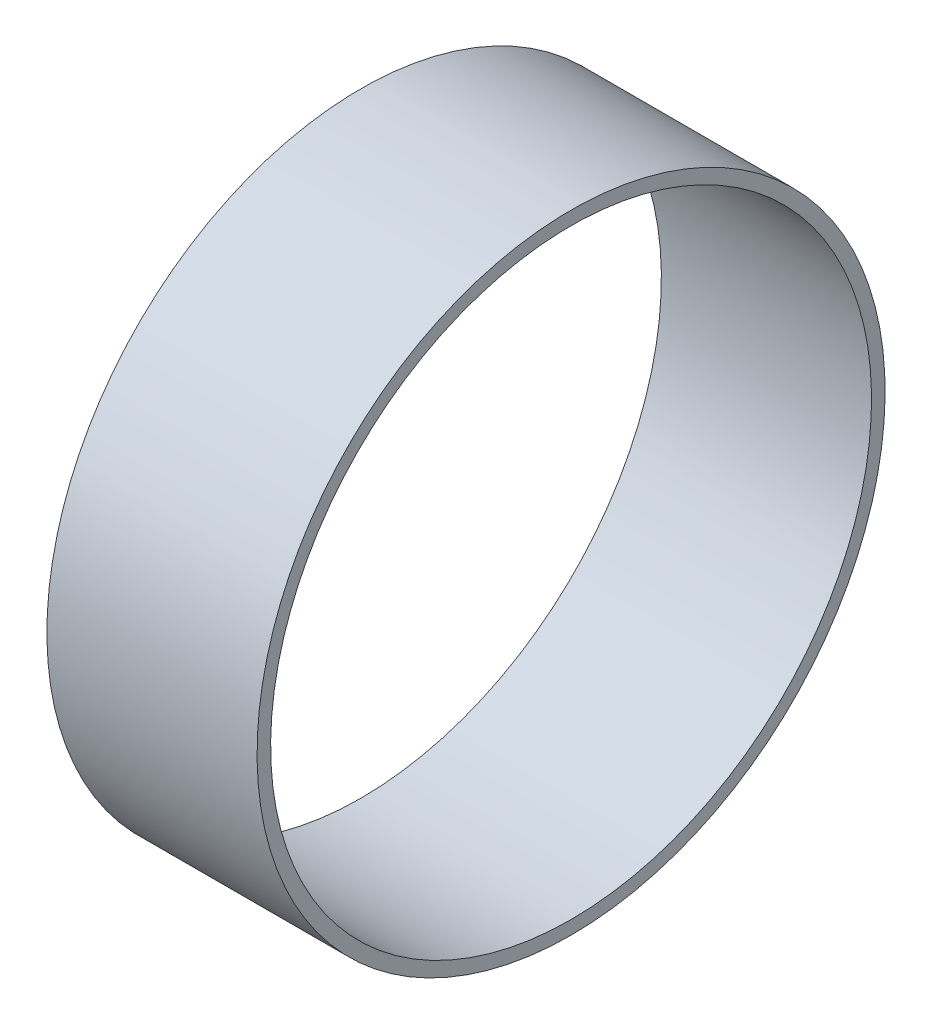
ISO-10303-21;
HEADER;
FILE_DESCRIPTION(('STEP AP214'),'2;1');
FILE_NAME('part.step','',(''),(''),'','','');
FILE_SCHEMA(('AUTOMOTIVE_DESIGN { 1 0 10303 214 1 1 1 1 }'));
ENDSEC;
DATA;
#1=APPLICATION_CONTEXT('core data for automotive mechanical design processes');
#2=APPLICATION_PROTOCOL_DEFINITION('international standard','automotive_design',2000,#1);
#3=PRODUCT_CONTEXT('',#1,'mechanical');
#4=PRODUCT('Part','Part','',(#3));
#5=PRODUCT_RELATED_PRODUCT_CATEGORY('part','',(#4));
#6=PRODUCT_DEFINITION_FORMATION('','',#4);
#7=PRODUCT_DEFINITION_CONTEXT('part definition',#1,'design');
#8=PRODUCT_DEFINITION('design','',#6,#7);
#9=PRODUCT_DEFINITION_SHAPE('','',#8);
#10=(LENGTH_UNIT() NAMED_UNIT(*) SI_UNIT(.MILLI.,.METRE.));
#11=(NAMED_UNIT(*) PLANE_ANGLE_UNIT() SI_UNIT($,.RADIAN.));
#12=(NAMED_UNIT(*) SI_UNIT($,.STERADIAN.) SOLID_ANGLE_UNIT());
#13=UNCERTAINTY_MEASURE_WITH_UNIT(LENGTH_MEASURE(1.E-05),#10,'distance_accuracy_value','');
#14=(GEOMETRIC_REPRESENTATION_CONTEXT(3) GLOBAL_UNCERTAINTY_ASSIGNED_CONTEXT((#13)) GLOBAL_UNIT_ASSIGNED_CONTEXT((#10,
#11,#12)) REPRESENTATION_CONTEXT('',''));
#15=CARTESIAN_POINT('',(0.,0.,0.));
#16=DIRECTION('',(0.,0.,1.));
#17=DIRECTION('',(1.,0.,0.));
#18=AXIS2_PLACEMENT_3D('',#15,#16,#17);
#19=CARTESIAN_POINT('',(0.,0.,0.));
#20=DIRECTION('',(-1.,0.,0.));
#21=DIRECTION('',(0.,-1.,0.));
#22=AXIS2_PLACEMENT_3D('',#19,#20,#21);
#23=CYLINDRICAL_SURFACE('',#22,22.16);
#24=CARTESIAN_POINT('',(45.2500000000002,2.60064976548235E-13,0.));
#25=DIRECTION('',(-1.,0.,0.));
#26=DIRECTION('',(0.,-1.,0.));
#27=AXIS2_PLACEMENT_3D('',#24,#25,#26);
#28=CIRCLE('',#27,22.16);
#29=CARTESIAN_POINT('',(45.2500000000003,-22.1599999999997,0.));
#30=VERTEX_POINT('',#29);
#31=EDGE_CURVE('E43',#30,#30,#28,.T.);
#32=ORIENTED_EDGE('',*,*,#31,.F.);
#33=EDGE_LOOP('',(#32));
#34=FACE_BOUND('',#33,.T.);
#35=CARTESIAN_POINT('',(29.7500000000001,1.70981945907403E-13,0.));
#36=DIRECTION('',(-1.,0.,0.));
#37=DIRECTION('',(0.,-1.,0.));
#38=AXIS2_PLACEMENT_3D('',#35,#36,#37);
#39=CIRCLE('',#38,22.1600000000001);
#40=CARTESIAN_POINT('',(29.7500000000002,-22.1599999999999,0.));
#41=VERTEX_POINT('',#40);
#42=EDGE_CURVE('E10',#41,#41,#39,.T.);
#43=ORIENTED_EDGE('',*,*,#42,.T.);
#44=EDGE_LOOP('',(#43));
#45=FACE_BOUND('',#44,.T.);
#46=ADVANCED_FACE('F29',(#34,#45),#23,.F.);
#47=CARTESIAN_POINT('',(29.75,22.1600000000002,0.));
#48=DIRECTION('',(-1.,0.,0.));
#49=DIRECTION('',(0.,-1.,0.));
#50=AXIS2_PLACEMENT_3D('',#47,#48,#49);
#51=PLANE('',#50);
#52=CARTESIAN_POINT('',(29.7500000000001,1.70981945907403E-13,0.));
#53=DIRECTION('',(-1.,0.,0.));
#54=DIRECTION('',(0.,-1.,0.));
#55=AXIS2_PLACEMENT_3D('',#52,#53,#54);
#56=CIRCLE('',#55,23.1600000000001);
#57=CARTESIAN_POINT('',(29.7500000000003,-23.1599999999999,0.));
#58=VERTEX_POINT('',#57);
#59=EDGE_CURVE('E35',#58,#58,#56,.T.);
#60=ORIENTED_EDGE('',*,*,#59,.T.);
#61=EDGE_LOOP('',(#60));
#62=FACE_BOUND('',#61,.T.);
#63=ORIENTED_EDGE('',*,*,#42,.F.);
#64=EDGE_LOOP('',(#63));
#65=FACE_BOUND('',#64,.T.);
#66=ADVANCED_FACE('F53',(#62,#65),#51,.T.);
#67=CARTESIAN_POINT('',(0.,0.,0.));
#68=DIRECTION('',(-1.,0.,0.));
#69=DIRECTION('',(0.,-1.,0.));
#70=AXIS2_PLACEMENT_3D('',#67,#68,#69);
#71=CYLINDRICAL_SURFACE('',#70,23.16);
#72=CARTESIAN_POINT('',(45.2500000000002,2.60064976548235E-13,0.));
#73=DIRECTION('',(-1.,0.,0.));
#74=DIRECTION('',(0.,-1.,0.));
#75=AXIS2_PLACEMENT_3D('',#72,#73,#74);
#76=CIRCLE('',#75,23.16);
#77=CARTESIAN_POINT('',(45.2500000000003,-23.1599999999997,0.));
#78=VERTEX_POINT('',#77);
#79=EDGE_CURVE('E39',#78,#78,#76,.T.);
#80=ORIENTED_EDGE('',*,*,#79,.T.);
#81=EDGE_LOOP('',(#80));
#82=FACE_BOUND('',#81,.T.);
#83=ORIENTED_EDGE('',*,*,#59,.F.);
#84=EDGE_LOOP('',(#83));
#85=FACE_BOUND('',#84,.T.);
#86=ADVANCED_FACE('F57',(#82,#85),#71,.T.);
#87=CARTESIAN_POINT('',(45.2500000000001,23.1600000000002,0.));
#88=DIRECTION('',(1.,0.,0.));
#89=DIRECTION('',(0.,1.,0.));
#90=AXIS2_PLACEMENT_3D('',#87,#88,#89);
#91=PLANE('',#90);
#92=ORIENTED_EDGE('',*,*,#31,.T.);
#93=EDGE_LOOP('',(#92));
#94=FACE_BOUND('',#93,.T.);
#95=ORIENTED_EDGE('',*,*,#79,.F.);
#96=EDGE_LOOP('',(#95));
#97=FACE_BOUND('',#96,.T.);
#98=ADVANCED_FACE('F49',(#94,#97),#91,.T.);
#99=CLOSED_SHELL('',(#46,#66,#86,#98));
#100=MANIFOLD_SOLID_BREP('B2',#99);
#101=ADVANCED_BREP_SHAPE_REPRESENTATION('',(#18,#100),#14);
#102=SHAPE_DEFINITION_REPRESENTATION(#9,#101);
ENDSEC;
END-ISO-10303-21;
